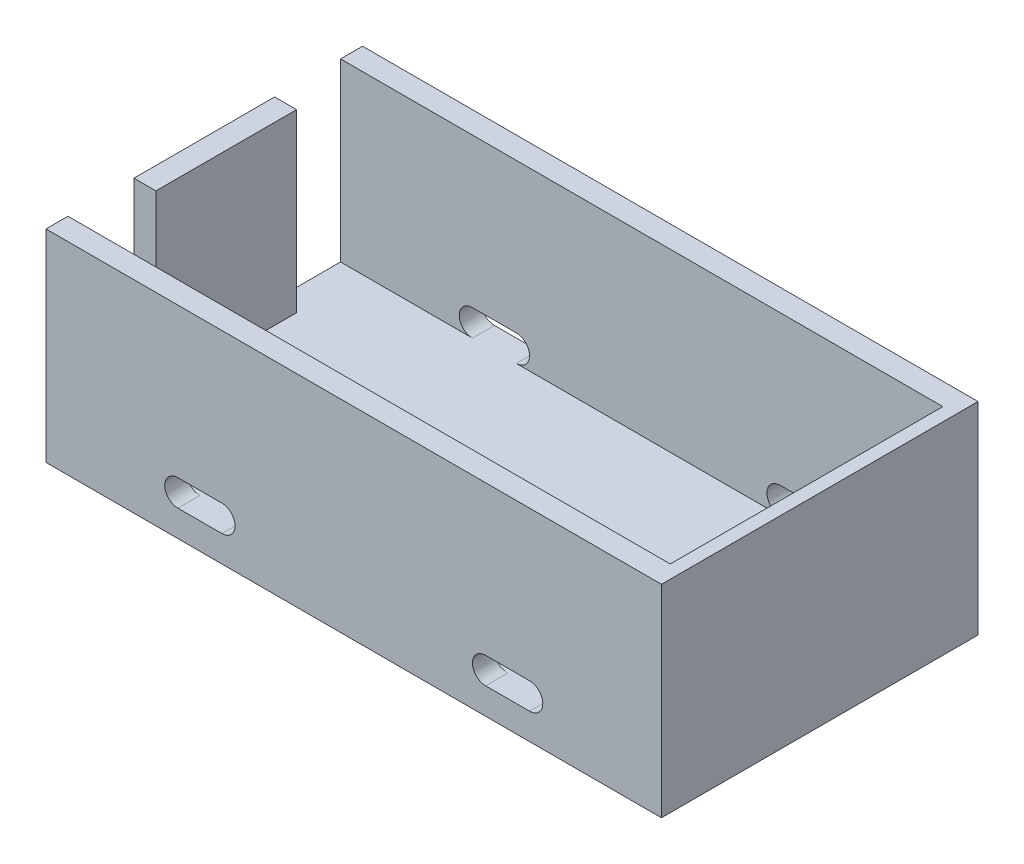
ISO-10303-21;
HEADER;
FILE_DESCRIPTION(('STEP AP214'),'2;1');
FILE_NAME('part.step','',(''),(''),'','','');
FILE_SCHEMA(('AUTOMOTIVE_DESIGN { 1 0 10303 214 1 1 1 1 }'));
ENDSEC;
DATA;
#1=APPLICATION_CONTEXT('core data for automotive mechanical design processes');
#2=APPLICATION_PROTOCOL_DEFINITION('international standard','automotive_design',2000,#1);
#3=PRODUCT_CONTEXT('',#1,'mechanical');
#4=PRODUCT('Part','Part','',(#3));
#5=PRODUCT_RELATED_PRODUCT_CATEGORY('part','',(#4));
#6=PRODUCT_DEFINITION_FORMATION('','',#4);
#7=PRODUCT_DEFINITION_CONTEXT('part definition',#1,'design');
#8=PRODUCT_DEFINITION('design','',#6,#7);
#9=PRODUCT_DEFINITION_SHAPE('','',#8);
#10=(LENGTH_UNIT() NAMED_UNIT(*) SI_UNIT(.MILLI.,.METRE.));
#11=(NAMED_UNIT(*) PLANE_ANGLE_UNIT() SI_UNIT($,.RADIAN.));
#12=(NAMED_UNIT(*) SI_UNIT($,.STERADIAN.) SOLID_ANGLE_UNIT());
#13=UNCERTAINTY_MEASURE_WITH_UNIT(LENGTH_MEASURE(1.E-05),#10,'distance_accuracy_value','');
#14=(GEOMETRIC_REPRESENTATION_CONTEXT(3) GLOBAL_UNCERTAINTY_ASSIGNED_CONTEXT((#13)) GLOBAL_UNIT_ASSIGNED_CONTEXT((#10,
#11,#12)) REPRESENTATION_CONTEXT('',''));
#15=CARTESIAN_POINT('',(0.,0.,0.));
#16=DIRECTION('',(0.,0.,1.));
#17=DIRECTION('',(1.,0.,0.));
#18=AXIS2_PLACEMENT_3D('',#15,#16,#17);
#19=CARTESIAN_POINT('',(70.,-3.,0.));
#20=DIRECTION('',(0.,0.,-1.));
#21=DIRECTION('',(-1.,0.,0.));
#22=AXIS2_PLACEMENT_3D('',#19,#20,#21);
#23=PLANE('',#22);
#24=DIRECTION('',(1.,0.,0.));
#25=VECTOR('',#24,1.);
#26=CARTESIAN_POINT('',(15.,0.,0.));
#27=LINE('',#26,#25);
#28=CARTESIAN_POINT('',(15.,0.,0.));
#29=VERTEX_POINT('',#28);
#30=CARTESIAN_POINT('',(20.,0.,0.));
#31=VERTEX_POINT('',#30);
#32=EDGE_CURVE('E255',#29,#31,#27,.T.);
#33=ORIENTED_EDGE('',*,*,#32,.F.);
#34=CARTESIAN_POINT('',(15.,1.5,0.));
#35=DIRECTION('',(0.,0.,1.));
#36=DIRECTION('',(1.,0.,0.));
#37=AXIS2_PLACEMENT_3D('',#34,#35,#36);
#38=CIRCLE('',#37,1.5);
#39=CARTESIAN_POINT('',(15.,3.,0.));
#40=VERTEX_POINT('',#39);
#41=EDGE_CURVE('E48',#40,#29,#38,.T.);
#42=ORIENTED_EDGE('',*,*,#41,.F.);
#43=DIRECTION('',(-1.,0.,0.));
#44=VECTOR('',#43,1.);
#45=CARTESIAN_POINT('',(70.,3.,0.));
#46=LINE('',#45,#44);
#47=CARTESIAN_POINT('',(20.,3.,0.));
#48=VERTEX_POINT('',#47);
#49=EDGE_CURVE('E101',#40,#48,#46,.F.);
#50=ORIENTED_EDGE('',*,*,#49,.T.);
#51=CARTESIAN_POINT('',(20.,1.5,0.));
#52=DIRECTION('',(0.,0.,1.));
#53=DIRECTION('',(1.,0.,0.));
#54=AXIS2_PLACEMENT_3D('',#51,#52,#53);
#55=CIRCLE('',#54,1.5);
#56=EDGE_CURVE('E237',#31,#48,#55,.T.);
#57=ORIENTED_EDGE('',*,*,#56,.F.);
#58=EDGE_LOOP('',(#33,#42,#50,#57));
#59=FACE_BOUND('',#58,.T.);
#60=DIRECTION('',(0.,1.,0.));
#61=VECTOR('',#60,1.);
#62=CARTESIAN_POINT('',(70.,-3.,0.));
#63=LINE('',#62,#61);
#64=CARTESIAN_POINT('',(70.,-3.,0.));
#65=VERTEX_POINT('',#64);
#66=CARTESIAN_POINT('',(70.,20.,0.));
#67=VERTEX_POINT('',#66);
#68=EDGE_CURVE('E353',#65,#67,#63,.T.);
#69=ORIENTED_EDGE('',*,*,#68,.T.);
#70=DIRECTION('',(1.,0.,0.));
#71=VECTOR('',#70,1.);
#72=CARTESIAN_POINT('',(0.,20.,0.));
#73=LINE('',#72,#71);
#74=CARTESIAN_POINT('',(0.,20.,0.));
#75=VERTEX_POINT('',#74);
#76=EDGE_CURVE('E320',#75,#67,#73,.T.);
#77=ORIENTED_EDGE('',*,*,#76,.F.);
#78=DIRECTION('',(0.,1.,0.));
#79=VECTOR('',#78,1.);
#80=CARTESIAN_POINT('',(0.,-3.,0.));
#81=LINE('',#80,#79);
#82=CARTESIAN_POINT('',(0.,-3.,0.));
#83=VERTEX_POINT('',#82);
#84=EDGE_CURVE('E350',#83,#75,#81,.T.);
#85=ORIENTED_EDGE('',*,*,#84,.F.);
#86=DIRECTION('',(-1.,0.,0.));
#87=VECTOR('',#86,1.);
#88=CARTESIAN_POINT('',(70.,-3.,0.));
#89=LINE('',#88,#87);
#90=EDGE_CURVE('E332',#65,#83,#89,.T.);
#91=ORIENTED_EDGE('',*,*,#90,.F.);
#92=EDGE_LOOP('',(#69,#77,#85,#91));
#93=FACE_BOUND('',#92,.T.);
#94=CARTESIAN_POINT('',(55.,1.5,0.));
#95=DIRECTION('',(0.,0.,1.));
#96=DIRECTION('',(1.,0.,0.));
#97=AXIS2_PLACEMENT_3D('',#94,#95,#96);
#98=CIRCLE('',#97,1.5);
#99=CARTESIAN_POINT('',(55.,3.,0.));
#100=VERTEX_POINT('',#99);
#101=CARTESIAN_POINT('',(55.,0.,0.));
#102=VERTEX_POINT('',#101);
#103=EDGE_CURVE('E260',#100,#102,#98,.F.);
#104=ORIENTED_EDGE('',*,*,#103,.T.);
#105=DIRECTION('',(-1.,0.,0.));
#106=VECTOR('',#105,1.);
#107=CARTESIAN_POINT('',(70.,0.,0.));
#108=LINE('',#107,#106);
#109=CARTESIAN_POINT('',(50.,0.,0.));
#110=VERTEX_POINT('',#109);
#111=EDGE_CURVE('E418',#102,#110,#108,.T.);
#112=ORIENTED_EDGE('',*,*,#111,.T.);
#113=CARTESIAN_POINT('',(50.,1.5,0.));
#114=DIRECTION('',(0.,0.,1.));
#115=DIRECTION('',(1.,0.,0.));
#116=AXIS2_PLACEMENT_3D('',#113,#114,#115);
#117=CIRCLE('',#116,1.5);
#118=CARTESIAN_POINT('',(50.,3.,0.));
#119=VERTEX_POINT('',#118);
#120=EDGE_CURVE('E414',#110,#119,#117,.F.);
#121=ORIENTED_EDGE('',*,*,#120,.T.);
#122=DIRECTION('',(-1.,0.,0.));
#123=VECTOR('',#122,1.);
#124=CARTESIAN_POINT('',(55.,3.,0.));
#125=LINE('',#124,#123);
#126=EDGE_CURVE('E200',#100,#119,#125,.T.);
#127=ORIENTED_EDGE('',*,*,#126,.F.);
#128=EDGE_LOOP('',(#104,#112,#121,#127));
#129=FACE_BOUND('',#128,.T.);
#130=ADVANCED_FACE('F44',(#59,#93,#129),#23,.F.);
#131=CARTESIAN_POINT('',(70.,-3.,-36.));
#132=DIRECTION('',(0.,0.,1.));
#133=DIRECTION('',(1.,0.,0.));
#134=AXIS2_PLACEMENT_3D('',#131,#132,#133);
#135=PLANE('',#134);
#136=DIRECTION('',(1.,0.,0.));
#137=VECTOR('',#136,1.);
#138=CARTESIAN_POINT('',(15.,3.,-36.));
#139=LINE('',#138,#137);
#140=CARTESIAN_POINT('',(15.,3.,-36.));
#141=VERTEX_POINT('',#140);
#142=CARTESIAN_POINT('',(20.,3.,-36.));
#143=VERTEX_POINT('',#142);
#144=EDGE_CURVE('E560',#141,#143,#139,.T.);
#145=ORIENTED_EDGE('',*,*,#144,.F.);
#146=CARTESIAN_POINT('',(15.,1.5,-36.));
#147=DIRECTION('',(0.,0.,1.));
#148=DIRECTION('',(1.,0.,0.));
#149=AXIS2_PLACEMENT_3D('',#146,#147,#148);
#150=CIRCLE('',#149,1.5);
#151=CARTESIAN_POINT('',(15.,0.,-36.));
#152=VERTEX_POINT('',#151);
#153=EDGE_CURVE('E552',#141,#152,#150,.T.);
#154=ORIENTED_EDGE('',*,*,#153,.T.);
#155=DIRECTION('',(1.,0.,0.));
#156=VECTOR('',#155,1.);
#157=CARTESIAN_POINT('',(15.,0.,-36.));
#158=LINE('',#157,#156);
#159=CARTESIAN_POINT('',(20.,0.,-36.));
#160=VERTEX_POINT('',#159);
#161=EDGE_CURVE('E611',#152,#160,#158,.T.);
#162=ORIENTED_EDGE('',*,*,#161,.T.);
#163=CARTESIAN_POINT('',(20.,1.5,-36.));
#164=DIRECTION('',(0.,0.,1.));
#165=DIRECTION('',(1.,0.,0.));
#166=AXIS2_PLACEMENT_3D('',#163,#164,#165);
#167=CIRCLE('',#166,1.5);
#168=EDGE_CURVE('E608',#160,#143,#167,.T.);
#169=ORIENTED_EDGE('',*,*,#168,.T.);
#170=EDGE_LOOP('',(#145,#154,#162,#169));
#171=FACE_BOUND('',#170,.T.);
#172=DIRECTION('',(0.,1.,0.));
#173=VECTOR('',#172,1.);
#174=CARTESIAN_POINT('',(0.,-3.,-36.));
#175=LINE('',#174,#173);
#176=CARTESIAN_POINT('',(0.,-3.,-36.));
#177=VERTEX_POINT('',#176);
#178=CARTESIAN_POINT('',(0.,20.,-36.));
#179=VERTEX_POINT('',#178);
#180=EDGE_CURVE('E347',#177,#179,#175,.T.);
#181=ORIENTED_EDGE('',*,*,#180,.T.);
#182=DIRECTION('',(1.,0.,0.));
#183=VECTOR('',#182,1.);
#184=CARTESIAN_POINT('',(0.,20.,-36.));
#185=LINE('',#184,#183);
#186=CARTESIAN_POINT('',(70.,20.,-36.));
#187=VERTEX_POINT('',#186);
#188=EDGE_CURVE('E282',#179,#187,#185,.T.);
#189=ORIENTED_EDGE('',*,*,#188,.T.);
#190=DIRECTION('',(0.,1.,0.));
#191=VECTOR('',#190,1.);
#192=CARTESIAN_POINT('',(70.,-3.,-36.));
#193=LINE('',#192,#191);
#194=CARTESIAN_POINT('',(70.,-3.,-36.));
#195=VERTEX_POINT('',#194);
#196=EDGE_CURVE('E342',#195,#187,#193,.T.);
#197=ORIENTED_EDGE('',*,*,#196,.F.);
#198=DIRECTION('',(1.,0.,0.));
#199=VECTOR('',#198,1.);
#200=CARTESIAN_POINT('',(70.,-3.,-36.));
#201=LINE('',#200,#199);
#202=EDGE_CURVE('E339',#177,#195,#201,.T.);
#203=ORIENTED_EDGE('',*,*,#202,.F.);
#204=EDGE_LOOP('',(#181,#189,#197,#203));
#205=FACE_BOUND('',#204,.T.);
#206=CARTESIAN_POINT('',(55.,1.5,-36.));
#207=DIRECTION('',(0.,0.,-1.));
#208=DIRECTION('',(-1.,0.,0.));
#209=AXIS2_PLACEMENT_3D('',#206,#207,#208);
#210=CIRCLE('',#209,1.5);
#211=CARTESIAN_POINT('',(55.,3.,-36.));
#212=VERTEX_POINT('',#211);
#213=CARTESIAN_POINT('',(55.,0.,-36.));
#214=VERTEX_POINT('',#213);
#215=EDGE_CURVE('E597',#212,#214,#210,.T.);
#216=ORIENTED_EDGE('',*,*,#215,.F.);
#217=DIRECTION('',(-1.,0.,0.));
#218=VECTOR('',#217,1.);
#219=CARTESIAN_POINT('',(55.,3.,-36.));
#220=LINE('',#219,#218);
#221=CARTESIAN_POINT('',(50.,3.,-36.));
#222=VERTEX_POINT('',#221);
#223=EDGE_CURVE('E572',#212,#222,#220,.T.);
#224=ORIENTED_EDGE('',*,*,#223,.T.);
#225=CARTESIAN_POINT('',(50.,1.5,-36.));
#226=DIRECTION('',(0.,0.,-1.));
#227=DIRECTION('',(-1.,0.,0.));
#228=AXIS2_PLACEMENT_3D('',#225,#226,#227);
#229=CIRCLE('',#228,1.5);
#230=CARTESIAN_POINT('',(50.,0.,-36.));
#231=VERTEX_POINT('',#230);
#232=EDGE_CURVE('E589',#231,#222,#229,.T.);
#233=ORIENTED_EDGE('',*,*,#232,.F.);
#234=DIRECTION('',(-1.,0.,0.));
#235=VECTOR('',#234,1.);
#236=CARTESIAN_POINT('',(55.,0.,-36.));
#237=LINE('',#236,#235);
#238=EDGE_CURVE('E593',#214,#231,#237,.T.);
#239=ORIENTED_EDGE('',*,*,#238,.F.);
#240=EDGE_LOOP('',(#216,#224,#233,#239));
#241=FACE_BOUND('',#240,.T.);
#242=ADVANCED_FACE('F477',(#171,#205,#241),#135,.F.);
#243=CARTESIAN_POINT('',(0.,20.,-2.5));
#244=DIRECTION('',(0.,0.,-1.));
#245=DIRECTION('',(-1.,0.,0.));
#246=AXIS2_PLACEMENT_3D('',#243,#244,#245);
#247=PLANE('',#246);
#248=CARTESIAN_POINT('',(15.,1.5,-2.5));
#249=DIRECTION('',(0.,0.,-1.));
#250=DIRECTION('',(-1.,0.,0.));
#251=AXIS2_PLACEMENT_3D('',#248,#249,#250);
#252=CIRCLE('',#251,1.5);
#253=CARTESIAN_POINT('',(15.,0.,-2.5));
#254=VERTEX_POINT('',#253);
#255=CARTESIAN_POINT('',(15.,3.,-2.5));
#256=VERTEX_POINT('',#255);
#257=EDGE_CURVE('E110',#254,#256,#252,.T.);
#258=ORIENTED_EDGE('',*,*,#257,.F.);
#259=DIRECTION('',(1.,0.,0.));
#260=VECTOR('',#259,1.);
#261=CARTESIAN_POINT('',(0.,0.,-2.5));
#262=LINE('',#261,#260);
#263=CARTESIAN_POINT('',(0.,0.,-2.5));
#264=VERTEX_POINT('',#263);
#265=EDGE_CURVE('E299',#264,#254,#262,.T.);
#266=ORIENTED_EDGE('',*,*,#265,.F.);
#267=DIRECTION('',(0.,-1.,0.));
#268=VECTOR('',#267,1.);
#269=CARTESIAN_POINT('',(0.,20.,-2.5));
#270=LINE('',#269,#268);
#271=CARTESIAN_POINT('',(0.,20.,-2.5));
#272=VERTEX_POINT('',#271);
#273=EDGE_CURVE('E304',#272,#264,#270,.T.);
#274=ORIENTED_EDGE('',*,*,#273,.F.);
#275=DIRECTION('',(1.,0.,0.));
#276=VECTOR('',#275,1.);
#277=CARTESIAN_POINT('',(0.,20.,-2.5));
#278=LINE('',#277,#276);
#279=CARTESIAN_POINT('',(68.5,20.,-2.5));
#280=VERTEX_POINT('',#279);
#281=EDGE_CURVE('E324',#272,#280,#278,.T.);
#282=ORIENTED_EDGE('',*,*,#281,.T.);
#283=DIRECTION('',(0.,-1.,0.));
#284=VECTOR('',#283,1.);
#285=CARTESIAN_POINT('',(68.5,20.,-2.50000000000002));
#286=LINE('',#285,#284);
#287=CARTESIAN_POINT('',(68.5,0.,-2.5));
#288=VERTEX_POINT('',#287);
#289=EDGE_CURVE('E300',#280,#288,#286,.T.);
#290=ORIENTED_EDGE('',*,*,#289,.T.);
#291=CARTESIAN_POINT('',(55.,0.,-2.5));
#292=VERTEX_POINT('',#291);
#293=EDGE_CURVE('E316',#292,#288,#262,.T.);
#294=ORIENTED_EDGE('',*,*,#293,.F.);
#295=CARTESIAN_POINT('',(55.,1.5,-2.5));
#296=DIRECTION('',(0.,0.,-1.));
#297=DIRECTION('',(-1.,0.,0.));
#298=AXIS2_PLACEMENT_3D('',#295,#296,#297);
#299=CIRCLE('',#298,1.5);
#300=CARTESIAN_POINT('',(55.,3.,-2.5));
#301=VERTEX_POINT('',#300);
#302=EDGE_CURVE('E263',#292,#301,#299,.F.);
#303=ORIENTED_EDGE('',*,*,#302,.T.);
#304=DIRECTION('',(1.,0.,0.));
#305=VECTOR('',#304,1.);
#306=CARTESIAN_POINT('',(0.,3.,-2.5));
#307=LINE('',#306,#305);
#308=CARTESIAN_POINT('',(50.,3.,-2.5));
#309=VERTEX_POINT('',#308);
#310=EDGE_CURVE('E413',#309,#301,#307,.T.);
#311=ORIENTED_EDGE('',*,*,#310,.F.);
#312=CARTESIAN_POINT('',(50.,1.5,-2.5));
#313=DIRECTION('',(0.,0.,-1.));
#314=DIRECTION('',(-1.,0.,0.));
#315=AXIS2_PLACEMENT_3D('',#312,#313,#314);
#316=CIRCLE('',#315,1.5);
#317=CARTESIAN_POINT('',(50.,0.,-2.5));
#318=VERTEX_POINT('',#317);
#319=EDGE_CURVE('E412',#309,#318,#316,.F.);
#320=ORIENTED_EDGE('',*,*,#319,.T.);
#321=CARTESIAN_POINT('',(20.,0.,-2.5));
#322=VERTEX_POINT('',#321);
#323=EDGE_CURVE('E253',#322,#318,#262,.T.);
#324=ORIENTED_EDGE('',*,*,#323,.F.);
#325=CARTESIAN_POINT('',(20.,1.5,-2.5));
#326=DIRECTION('',(0.,0.,-1.));
#327=DIRECTION('',(-1.,0.,0.));
#328=AXIS2_PLACEMENT_3D('',#325,#326,#327);
#329=CIRCLE('',#328,1.5);
#330=CARTESIAN_POINT('',(20.,3.,-2.5));
#331=VERTEX_POINT('',#330);
#332=EDGE_CURVE('E243',#331,#322,#329,.T.);
#333=ORIENTED_EDGE('',*,*,#332,.F.);
#334=DIRECTION('',(-1.,0.,0.));
#335=VECTOR('',#334,1.);
#336=CARTESIAN_POINT('',(0.,3.,-2.5));
#337=LINE('',#336,#335);
#338=EDGE_CURVE('E229',#331,#256,#337,.T.);
#339=ORIENTED_EDGE('',*,*,#338,.T.);
#340=EDGE_LOOP('',(#258,#266,#274,#282,#290,#294,#303,#311,#320,#324,#333,#339));
#341=FACE_BOUND('',#340,.T.);
#342=ADVANCED_FACE('F250',(#341),#247,.T.);
#343=CARTESIAN_POINT('',(0.,20.,-33.5));
#344=DIRECTION('',(0.,0.,-1.));
#345=DIRECTION('',(-1.,0.,0.));
#346=AXIS2_PLACEMENT_3D('',#343,#344,#345);
#347=PLANE('',#346);
#348=DIRECTION('',(1.,0.,0.));
#349=VECTOR('',#348,1.);
#350=CARTESIAN_POINT('',(0.,0.,-33.5));
#351=LINE('',#350,#349);
#352=CARTESIAN_POINT('',(0.,0.,-33.5));
#353=VERTEX_POINT('',#352);
#354=CARTESIAN_POINT('',(15.,0.,-33.5));
#355=VERTEX_POINT('',#354);
#356=EDGE_CURVE('E273',#353,#355,#351,.T.);
#357=ORIENTED_EDGE('',*,*,#356,.T.);
#358=CARTESIAN_POINT('',(15.,1.5,-33.5));
#359=DIRECTION('',(0.,0.,-1.));
#360=DIRECTION('',(-1.,0.,0.));
#361=AXIS2_PLACEMENT_3D('',#358,#359,#360);
#362=CIRCLE('',#361,1.5);
#363=CARTESIAN_POINT('',(15.,3.,-33.5));
#364=VERTEX_POINT('',#363);
#365=EDGE_CURVE('E11',#355,#364,#362,.T.);
#366=ORIENTED_EDGE('',*,*,#365,.T.);
#367=DIRECTION('',(-1.,0.,0.));
#368=VECTOR('',#367,1.);
#369=CARTESIAN_POINT('',(0.,3.,-33.5));
#370=LINE('',#369,#368);
#371=CARTESIAN_POINT('',(20.,3.,-33.5));
#372=VERTEX_POINT('',#371);
#373=EDGE_CURVE('E54',#372,#364,#370,.T.);
#374=ORIENTED_EDGE('',*,*,#373,.F.);
#375=CARTESIAN_POINT('',(20.,1.5,-33.5));
#376=DIRECTION('',(0.,0.,-1.));
#377=DIRECTION('',(-1.,0.,0.));
#378=AXIS2_PLACEMENT_3D('',#375,#376,#377);
#379=CIRCLE('',#378,1.5);
#380=CARTESIAN_POINT('',(20.,0.,-33.5));
#381=VERTEX_POINT('',#380);
#382=EDGE_CURVE('E404',#372,#381,#379,.T.);
#383=ORIENTED_EDGE('',*,*,#382,.T.);
#384=CARTESIAN_POINT('',(50.,0.,-33.5));
#385=VERTEX_POINT('',#384);
#386=EDGE_CURVE('E278',#381,#385,#351,.T.);
#387=ORIENTED_EDGE('',*,*,#386,.T.);
#388=CARTESIAN_POINT('',(50.,1.5,-33.5));
#389=DIRECTION('',(0.,0.,-1.));
#390=DIRECTION('',(-1.,0.,0.));
#391=AXIS2_PLACEMENT_3D('',#388,#389,#390);
#392=CIRCLE('',#391,1.5);
#393=CARTESIAN_POINT('',(50.,3.,-33.5));
#394=VERTEX_POINT('',#393);
#395=EDGE_CURVE('E397',#394,#385,#392,.F.);
#396=ORIENTED_EDGE('',*,*,#395,.F.);
#397=DIRECTION('',(1.,0.,0.));
#398=VECTOR('',#397,1.);
#399=CARTESIAN_POINT('',(0.,3.,-33.5));
#400=LINE('',#399,#398);
#401=CARTESIAN_POINT('',(55.,3.,-33.5));
#402=VERTEX_POINT('',#401);
#403=EDGE_CURVE('E210',#394,#402,#400,.T.);
#404=ORIENTED_EDGE('',*,*,#403,.T.);
#405=CARTESIAN_POINT('',(55.,1.5,-33.5));
#406=DIRECTION('',(0.,0.,-1.));
#407=DIRECTION('',(-1.,0.,0.));
#408=AXIS2_PLACEMENT_3D('',#405,#406,#407);
#409=CIRCLE('',#408,1.5);
#410=CARTESIAN_POINT('',(55.,0.,-33.5));
#411=VERTEX_POINT('',#410);
#412=EDGE_CURVE('E400',#411,#402,#409,.F.);
#413=ORIENTED_EDGE('',*,*,#412,.F.);
#414=CARTESIAN_POINT('',(68.5,0.,-33.5));
#415=VERTEX_POINT('',#414);
#416=EDGE_CURVE('E279',#411,#415,#351,.T.);
#417=ORIENTED_EDGE('',*,*,#416,.T.);
#418=DIRECTION('',(0.,-1.,0.));
#419=VECTOR('',#418,1.);
#420=CARTESIAN_POINT('',(68.5,20.,-33.5));
#421=LINE('',#420,#419);
#422=CARTESIAN_POINT('',(68.5,20.,-33.5));
#423=VERTEX_POINT('',#422);
#424=EDGE_CURVE('E294',#423,#415,#421,.T.);
#425=ORIENTED_EDGE('',*,*,#424,.F.);
#426=DIRECTION('',(1.,0.,0.));
#427=VECTOR('',#426,1.);
#428=CARTESIAN_POINT('',(0.,20.,-33.5));
#429=LINE('',#428,#427);
#430=CARTESIAN_POINT('',(0.,20.,-33.5));
#431=VERTEX_POINT('',#430);
#432=EDGE_CURVE('E290',#431,#423,#429,.T.);
#433=ORIENTED_EDGE('',*,*,#432,.F.);
#434=DIRECTION('',(0.,-1.,0.));
#435=VECTOR('',#434,1.);
#436=CARTESIAN_POINT('',(0.,20.,-33.5));
#437=LINE('',#436,#435);
#438=EDGE_CURVE('E268',#431,#353,#437,.T.);
#439=ORIENTED_EDGE('',*,*,#438,.T.);
#440=EDGE_LOOP('',(#357,#366,#374,#383,#387,#396,#404,#413,#417,#425,#433,#439));
#441=FACE_BOUND('',#440,.T.);
#442=ADVANCED_FACE('F453',(#441),#347,.F.);
#443=CARTESIAN_POINT('',(0.,20.,-10.));
#444=DIRECTION('',(0.,0.,-1.));
#445=DIRECTION('',(-1.,0.,0.));
#446=AXIS2_PLACEMENT_3D('',#443,#444,#445);
#447=PLANE('',#446);
#448=DIRECTION('',(1.,0.,0.));
#449=VECTOR('',#448,1.);
#450=CARTESIAN_POINT('',(0.,0.,-10.));
#451=LINE('',#450,#449);
#452=CARTESIAN_POINT('',(0.,0.,-10.));
#453=VERTEX_POINT('',#452);
#454=CARTESIAN_POINT('',(2.5,0.,-10.));
#455=VERTEX_POINT('',#454);
#456=EDGE_CURVE('E356',#453,#455,#451,.T.);
#457=ORIENTED_EDGE('',*,*,#456,.T.);
#458=DIRECTION('',(0.,-1.,0.));
#459=VECTOR('',#458,1.);
#460=CARTESIAN_POINT('',(2.5,20.,-10.));
#461=LINE('',#460,#459);
#462=CARTESIAN_POINT('',(2.5,20.,-10.));
#463=VERTEX_POINT('',#462);
#464=EDGE_CURVE('E391',#463,#455,#461,.T.);
#465=ORIENTED_EDGE('',*,*,#464,.F.);
#466=DIRECTION('',(1.,0.,0.));
#467=VECTOR('',#466,1.);
#468=CARTESIAN_POINT('',(0.,20.,-10.));
#469=LINE('',#468,#467);
#470=CARTESIAN_POINT('',(0.,20.,-10.));
#471=VERTEX_POINT('',#470);
#472=EDGE_CURVE('E357',#471,#463,#469,.T.);
#473=ORIENTED_EDGE('',*,*,#472,.F.);
#474=DIRECTION('',(0.,-1.,0.));
#475=VECTOR('',#474,1.);
#476=CARTESIAN_POINT('',(0.,20.,-10.));
#477=LINE('',#476,#475);
#478=EDGE_CURVE('E372',#471,#453,#477,.T.);
#479=ORIENTED_EDGE('',*,*,#478,.T.);
#480=EDGE_LOOP('',(#457,#465,#473,#479));
#481=FACE_BOUND('',#480,.T.);
#482=ADVANCED_FACE('F46',(#481),#447,.F.);
#483=CARTESIAN_POINT('',(2.5,20.,-26.));
#484=DIRECTION('',(1.,0.,0.));
#485=DIRECTION('',(0.,0.,-1.));
#486=AXIS2_PLACEMENT_3D('',#483,#484,#485);
#487=PLANE('',#486);
#488=DIRECTION('',(0.,0.,1.));
#489=VECTOR('',#488,1.);
#490=CARTESIAN_POINT('',(2.5,0.,-26.));
#491=LINE('',#490,#489);
#492=CARTESIAN_POINT('',(2.5,0.,-26.));
#493=VERTEX_POINT('',#492);
#494=EDGE_CURVE('E375',#493,#455,#491,.T.);
#495=ORIENTED_EDGE('',*,*,#494,.F.);
#496=DIRECTION('',(0.,-1.,0.));
#497=VECTOR('',#496,1.);
#498=CARTESIAN_POINT('',(2.5,20.,-26.));
#499=LINE('',#498,#497);
#500=CARTESIAN_POINT('',(2.5,20.,-26.));
#501=VERTEX_POINT('',#500);
#502=EDGE_CURVE('E388',#501,#493,#499,.T.);
#503=ORIENTED_EDGE('',*,*,#502,.F.);
#504=DIRECTION('',(0.,0.,1.));
#505=VECTOR('',#504,1.);
#506=CARTESIAN_POINT('',(2.5,20.,-26.));
#507=LINE('',#506,#505);
#508=EDGE_CURVE('E360',#501,#463,#507,.T.);
#509=ORIENTED_EDGE('',*,*,#508,.T.);
#510=ORIENTED_EDGE('',*,*,#464,.T.);
#511=EDGE_LOOP('',(#495,#503,#509,#510));
#512=FACE_BOUND('',#511,.T.);
#513=ADVANCED_FACE('F791',(#512),#487,.T.);
#514=CARTESIAN_POINT('',(0.,20.,-26.));
#515=DIRECTION('',(0.,0.,-1.));
#516=DIRECTION('',(-1.,0.,0.));
#517=AXIS2_PLACEMENT_3D('',#514,#515,#516);
#518=PLANE('',#517);
#519=DIRECTION('',(1.,0.,0.));
#520=VECTOR('',#519,1.);
#521=CARTESIAN_POINT('',(0.,0.,-26.));
#522=LINE('',#521,#520);
#523=CARTESIAN_POINT('',(0.,0.,-26.));
#524=VERTEX_POINT('',#523);
#525=EDGE_CURVE('E361',#524,#493,#522,.T.);
#526=ORIENTED_EDGE('',*,*,#525,.F.);
#527=DIRECTION('',(0.,-1.,0.));
#528=VECTOR('',#527,1.);
#529=CARTESIAN_POINT('',(0.,20.,-26.));
#530=LINE('',#529,#528);
#531=CARTESIAN_POINT('',(0.,20.,-26.));
#532=VERTEX_POINT('',#531);
#533=EDGE_CURVE('E385',#532,#524,#530,.T.);
#534=ORIENTED_EDGE('',*,*,#533,.F.);
#535=DIRECTION('',(1.,0.,0.));
#536=VECTOR('',#535,1.);
#537=CARTESIAN_POINT('',(0.,20.,-26.));
#538=LINE('',#537,#536);
#539=EDGE_CURVE('E365',#532,#501,#538,.T.);
#540=ORIENTED_EDGE('',*,*,#539,.T.);
#541=ORIENTED_EDGE('',*,*,#502,.T.);
#542=EDGE_LOOP('',(#526,#534,#540,#541));
#543=FACE_BOUND('',#542,.T.);
#544=ADVANCED_FACE('F782',(#543),#518,.T.);
#545=CARTESIAN_POINT('',(0.,20.,-26.));
#546=DIRECTION('',(1.,0.,0.));
#547=DIRECTION('',(0.,0.,-1.));
#548=AXIS2_PLACEMENT_3D('',#545,#546,#547);
#549=PLANE('',#548);
#550=ORIENTED_EDGE('',*,*,#533,.T.);
#551=DIRECTION('',(0.,0.,-1.));
#552=VECTOR('',#551,1.);
#553=CARTESIAN_POINT('',(0.,0.,0.));
#554=LINE('',#553,#552);
#555=EDGE_CURVE('E277',#524,#353,#554,.T.);
#556=ORIENTED_EDGE('',*,*,#555,.T.);
#557=ORIENTED_EDGE('',*,*,#438,.F.);
#558=DIRECTION('',(0.,0.,1.));
#559=VECTOR('',#558,1.);
#560=CARTESIAN_POINT('',(0.,20.,-36.));
#561=LINE('',#560,#559);
#562=EDGE_CURVE('E271',#179,#431,#561,.T.);
#563=ORIENTED_EDGE('',*,*,#562,.F.);
#564=ORIENTED_EDGE('',*,*,#180,.F.);
#565=DIRECTION('',(0.,0.,-1.));
#566=VECTOR('',#565,1.);
#567=CARTESIAN_POINT('',(0.,-3.,0.));
#568=LINE('',#567,#566);
#569=EDGE_CURVE('E336',#83,#177,#568,.T.);
#570=ORIENTED_EDGE('',*,*,#569,.F.);
#571=ORIENTED_EDGE('',*,*,#84,.T.);
#572=DIRECTION('',(0.,0.,-1.));
#573=VECTOR('',#572,1.);
#574=CARTESIAN_POINT('',(0.,20.,0.));
#575=LINE('',#574,#573);
#576=EDGE_CURVE('E313',#75,#272,#575,.T.);
#577=ORIENTED_EDGE('',*,*,#576,.T.);
#578=ORIENTED_EDGE('',*,*,#273,.T.);
#579=EDGE_CURVE('E333',#264,#453,#554,.T.);
#580=ORIENTED_EDGE('',*,*,#579,.T.);
#581=ORIENTED_EDGE('',*,*,#478,.F.);
#582=DIRECTION('',(0.,0.,1.));
#583=VECTOR('',#582,1.);
#584=CARTESIAN_POINT('',(0.,20.,-26.));
#585=LINE('',#584,#583);
#586=EDGE_CURVE('E369',#532,#471,#585,.T.);
#587=ORIENTED_EDGE('',*,*,#586,.F.);
#588=EDGE_LOOP('',(#550,#556,#557,#563,#564,#570,#571,#577,#578,#580,#581,#587));
#589=FACE_BOUND('',#588,.T.);
#590=ADVANCED_FACE('F440',(#589),#549,.F.);
#591=CARTESIAN_POINT('',(0.,20.,0.));
#592=DIRECTION('',(0.,-1.,0.));
#593=DIRECTION('',(0.,0.,-1.));
#594=AXIS2_PLACEMENT_3D('',#591,#592,#593);
#595=PLANE('',#594);
#596=ORIENTED_EDGE('',*,*,#472,.T.);
#597=ORIENTED_EDGE('',*,*,#508,.F.);
#598=ORIENTED_EDGE('',*,*,#539,.F.);
#599=ORIENTED_EDGE('',*,*,#586,.T.);
#600=EDGE_LOOP('',(#596,#597,#598,#599));
#601=FACE_BOUND('',#600,.T.);
#602=ADVANCED_FACE('F492',(#601),#595,.F.);
#603=CARTESIAN_POINT('',(0.,0.,0.));
#604=DIRECTION('',(0.,1.,0.));
#605=DIRECTION('',(0.,0.,1.));
#606=AXIS2_PLACEMENT_3D('',#603,#604,#605);
#607=PLANE('',#606);
#608=ORIENTED_EDGE('',*,*,#416,.F.);
#609=DIRECTION('',(0.,0.,1.));
#610=VECTOR('',#609,1.);
#611=CARTESIAN_POINT('',(55.,0.,-36.));
#612=LINE('',#611,#610);
#613=EDGE_CURVE('E582',#214,#411,#612,.T.);
#614=ORIENTED_EDGE('',*,*,#613,.F.);
#615=ORIENTED_EDGE('',*,*,#238,.T.);
#616=DIRECTION('',(0.,0.,1.));
#617=VECTOR('',#616,1.);
#618=CARTESIAN_POINT('',(50.,0.,-36.));
#619=LINE('',#618,#617);
#620=EDGE_CURVE('E577',#231,#385,#619,.T.);
#621=ORIENTED_EDGE('',*,*,#620,.T.);
#622=ORIENTED_EDGE('',*,*,#386,.F.);
#623=DIRECTION('',(0.,0.,1.));
#624=VECTOR('',#623,1.);
#625=CARTESIAN_POINT('',(20.,0.,-36.));
#626=LINE('',#625,#624);
#627=EDGE_CURVE('E248',#160,#381,#626,.T.);
#628=ORIENTED_EDGE('',*,*,#627,.F.);
#629=ORIENTED_EDGE('',*,*,#161,.F.);
#630=DIRECTION('',(0.,0.,1.));
#631=VECTOR('',#630,1.);
#632=CARTESIAN_POINT('',(15.,0.,-36.));
#633=LINE('',#632,#631);
#634=EDGE_CURVE('E450',#152,#355,#633,.T.);
#635=ORIENTED_EDGE('',*,*,#634,.T.);
#636=ORIENTED_EDGE('',*,*,#356,.F.);
#637=ORIENTED_EDGE('',*,*,#555,.F.);
#638=ORIENTED_EDGE('',*,*,#525,.T.);
#639=ORIENTED_EDGE('',*,*,#494,.T.);
#640=ORIENTED_EDGE('',*,*,#456,.F.);
#641=ORIENTED_EDGE('',*,*,#579,.F.);
#642=ORIENTED_EDGE('',*,*,#265,.T.);
#643=EDGE_CURVE('E62',#254,#29,#633,.T.);
#644=ORIENTED_EDGE('',*,*,#643,.T.);
#645=ORIENTED_EDGE('',*,*,#32,.T.);
#646=EDGE_CURVE('E566',#322,#31,#626,.T.);
#647=ORIENTED_EDGE('',*,*,#646,.F.);
#648=ORIENTED_EDGE('',*,*,#323,.T.);
#649=EDGE_CURVE('E581',#318,#110,#619,.T.);
#650=ORIENTED_EDGE('',*,*,#649,.T.);
#651=ORIENTED_EDGE('',*,*,#111,.F.);
#652=EDGE_CURVE('E585',#292,#102,#612,.T.);
#653=ORIENTED_EDGE('',*,*,#652,.F.);
#654=ORIENTED_EDGE('',*,*,#293,.T.);
#655=DIRECTION('',(0.,0.,1.));
#656=VECTOR('',#655,1.);
#657=CARTESIAN_POINT('',(68.5,0.,-33.5));
#658=LINE('',#657,#656);
#659=EDGE_CURVE('E272',#415,#288,#658,.T.);
#660=ORIENTED_EDGE('',*,*,#659,.F.);
#661=EDGE_LOOP('',(#608,#614,#615,#621,#622,#628,#629,#635,#636,#637,#638,#639,#640,#641,#642,
#644,#645,#647,#648,#650,#651,#653,#654,#660));
#662=FACE_BOUND('',#661,.T.);
#663=ADVANCED_FACE('F447',(#662),#607,.T.);
#664=CARTESIAN_POINT('',(70.,-3.,0.));
#665=DIRECTION('',(-1.,0.,0.));
#666=DIRECTION('',(0.,0.,1.));
#667=AXIS2_PLACEMENT_3D('',#664,#665,#666);
#668=PLANE('',#667);
#669=ORIENTED_EDGE('',*,*,#196,.T.);
#670=DIRECTION('',(0.,0.,1.));
#671=VECTOR('',#670,1.);
#672=CARTESIAN_POINT('',(70.,20.,-36.));
#673=LINE('',#672,#671);
#674=EDGE_CURVE('E286',#187,#67,#673,.T.);
#675=ORIENTED_EDGE('',*,*,#674,.T.);
#676=ORIENTED_EDGE('',*,*,#68,.F.);
#677=DIRECTION('',(0.,0.,1.));
#678=VECTOR('',#677,1.);
#679=CARTESIAN_POINT('',(70.,-3.,0.));
#680=LINE('',#679,#678);
#681=EDGE_CURVE('E328',#195,#65,#680,.T.);
#682=ORIENTED_EDGE('',*,*,#681,.F.);
#683=EDGE_LOOP('',(#669,#675,#676,#682));
#684=FACE_BOUND('',#683,.T.);
#685=ADVANCED_FACE('F483',(#684),#668,.F.);
#686=CARTESIAN_POINT('',(0.,-3.,0.));
#687=DIRECTION('',(0.,1.,0.));
#688=DIRECTION('',(0.,0.,1.));
#689=AXIS2_PLACEMENT_3D('',#686,#687,#688);
#690=PLANE('',#689);
#691=ORIENTED_EDGE('',*,*,#681,.T.);
#692=ORIENTED_EDGE('',*,*,#90,.T.);
#693=ORIENTED_EDGE('',*,*,#569,.T.);
#694=ORIENTED_EDGE('',*,*,#202,.T.);
#695=EDGE_LOOP('',(#691,#692,#693,#694));
#696=FACE_BOUND('',#695,.T.);
#697=ADVANCED_FACE('F482',(#696),#690,.F.);
#698=CARTESIAN_POINT('',(0.,20.,0.));
#699=DIRECTION('',(0.,1.,0.));
#700=DIRECTION('',(0.,0.,1.));
#701=AXIS2_PLACEMENT_3D('',#698,#699,#700);
#702=PLANE('',#701);
#703=ORIENTED_EDGE('',*,*,#281,.F.);
#704=ORIENTED_EDGE('',*,*,#576,.F.);
#705=ORIENTED_EDGE('',*,*,#76,.T.);
#706=ORIENTED_EDGE('',*,*,#674,.F.);
#707=ORIENTED_EDGE('',*,*,#188,.F.);
#708=ORIENTED_EDGE('',*,*,#562,.T.);
#709=ORIENTED_EDGE('',*,*,#432,.T.);
#710=DIRECTION('',(0.,0.,1.));
#711=VECTOR('',#710,1.);
#712=CARTESIAN_POINT('',(68.5,20.,-33.5));
#713=LINE('',#712,#711);
#714=EDGE_CURVE('E298',#423,#280,#713,.T.);
#715=ORIENTED_EDGE('',*,*,#714,.T.);
#716=EDGE_LOOP('',(#703,#704,#705,#706,#707,#708,#709,#715));
#717=FACE_BOUND('',#716,.T.);
#718=ADVANCED_FACE('F458',(#717),#702,.T.);
#719=CARTESIAN_POINT('',(68.5,20.,-33.5));
#720=DIRECTION('',(1.,0.,0.));
#721=DIRECTION('',(0.,0.,-1.));
#722=AXIS2_PLACEMENT_3D('',#719,#720,#721);
#723=PLANE('',#722);
#724=ORIENTED_EDGE('',*,*,#659,.T.);
#725=ORIENTED_EDGE('',*,*,#289,.F.);
#726=ORIENTED_EDGE('',*,*,#714,.F.);
#727=ORIENTED_EDGE('',*,*,#424,.T.);
#728=EDGE_LOOP('',(#724,#725,#726,#727));
#729=FACE_BOUND('',#728,.T.);
#730=ADVANCED_FACE('F461',(#729),#723,.F.);
#731=CARTESIAN_POINT('',(55.,3.,-36.));
#732=DIRECTION('',(0.,1.,0.));
#733=DIRECTION('',(-1.,0.,0.));
#734=AXIS2_PLACEMENT_3D('',#731,#732,#733);
#735=PLANE('',#734);
#736=DIRECTION('',(0.,0.,1.));
#737=VECTOR('',#736,1.);
#738=CARTESIAN_POINT('',(50.,3.,-36.));
#739=LINE('',#738,#737);
#740=EDGE_CURVE('E573',#222,#394,#739,.T.);
#741=ORIENTED_EDGE('',*,*,#740,.F.);
#742=ORIENTED_EDGE('',*,*,#223,.F.);
#743=DIRECTION('',(0.,0.,1.));
#744=VECTOR('',#743,1.);
#745=CARTESIAN_POINT('',(55.,3.,-36.));
#746=LINE('',#745,#744);
#747=EDGE_CURVE('E569',#212,#402,#746,.T.);
#748=ORIENTED_EDGE('',*,*,#747,.T.);
#749=ORIENTED_EDGE('',*,*,#403,.F.);
#750=EDGE_LOOP('',(#741,#742,#748,#749));
#751=FACE_BOUND('',#750,.T.);
#752=ADVANCED_FACE('F509',(#751),#735,.F.);
#753=CARTESIAN_POINT('',(50.,1.5,-36.));
#754=DIRECTION('',(0.,0.,1.));
#755=DIRECTION('',(1.,0.,0.));
#756=AXIS2_PLACEMENT_3D('',#753,#754,#755);
#757=CYLINDRICAL_SURFACE('',#756,1.5);
#758=ORIENTED_EDGE('',*,*,#395,.T.);
#759=ORIENTED_EDGE('',*,*,#620,.F.);
#760=ORIENTED_EDGE('',*,*,#232,.T.);
#761=ORIENTED_EDGE('',*,*,#740,.T.);
#762=EDGE_LOOP('',(#758,#759,#760,#761));
#763=FACE_BOUND('',#762,.T.);
#764=ADVANCED_FACE('F521',(#763),#757,.F.);
#765=CARTESIAN_POINT('',(55.,1.5,-36.));
#766=DIRECTION('',(0.,0.,1.));
#767=DIRECTION('',(1.,0.,0.));
#768=AXIS2_PLACEMENT_3D('',#765,#766,#767);
#769=CYLINDRICAL_SURFACE('',#768,1.5);
#770=ORIENTED_EDGE('',*,*,#412,.T.);
#771=ORIENTED_EDGE('',*,*,#747,.F.);
#772=ORIENTED_EDGE('',*,*,#215,.T.);
#773=ORIENTED_EDGE('',*,*,#613,.T.);
#774=EDGE_LOOP('',(#770,#771,#772,#773));
#775=FACE_BOUND('',#774,.T.);
#776=ADVANCED_FACE('F526',(#775),#769,.F.);
#777=CARTESIAN_POINT('',(20.,1.5,-36.));
#778=DIRECTION('',(0.,0.,1.));
#779=DIRECTION('',(1.,0.,0.));
#780=AXIS2_PLACEMENT_3D('',#777,#778,#779);
#781=CYLINDRICAL_SURFACE('',#780,1.5);
#782=DIRECTION('',(0.,0.,1.));
#783=VECTOR('',#782,1.);
#784=CARTESIAN_POINT('',(20.,3.,-36.));
#785=LINE('',#784,#783);
#786=EDGE_CURVE('E247',#143,#372,#785,.T.);
#787=ORIENTED_EDGE('',*,*,#786,.F.);
#788=ORIENTED_EDGE('',*,*,#168,.F.);
#789=ORIENTED_EDGE('',*,*,#627,.T.);
#790=ORIENTED_EDGE('',*,*,#382,.F.);
#791=EDGE_LOOP('',(#787,#788,#789,#790));
#792=FACE_BOUND('',#791,.T.);
#793=ADVANCED_FACE('F531',(#792),#781,.F.);
#794=CARTESIAN_POINT('',(15.,3.,-36.));
#795=DIRECTION('',(0.,-1.,0.));
#796=DIRECTION('',(1.,0.,0.));
#797=AXIS2_PLACEMENT_3D('',#794,#795,#796);
#798=PLANE('',#797);
#799=ORIENTED_EDGE('',*,*,#373,.T.);
#800=DIRECTION('',(0.,0.,1.));
#801=VECTOR('',#800,1.);
#802=CARTESIAN_POINT('',(15.,3.,-36.));
#803=LINE('',#802,#801);
#804=EDGE_CURVE('E548',#141,#364,#803,.T.);
#805=ORIENTED_EDGE('',*,*,#804,.F.);
#806=ORIENTED_EDGE('',*,*,#144,.T.);
#807=ORIENTED_EDGE('',*,*,#786,.T.);
#808=EDGE_LOOP('',(#799,#805,#806,#807));
#809=FACE_BOUND('',#808,.T.);
#810=ADVANCED_FACE('F533',(#809),#798,.T.);
#811=CARTESIAN_POINT('',(15.,1.5,-36.));
#812=DIRECTION('',(0.,0.,1.));
#813=DIRECTION('',(1.,0.,0.));
#814=AXIS2_PLACEMENT_3D('',#811,#812,#813);
#815=CYLINDRICAL_SURFACE('',#814,1.5);
#816=ORIENTED_EDGE('',*,*,#634,.F.);
#817=ORIENTED_EDGE('',*,*,#153,.F.);
#818=ORIENTED_EDGE('',*,*,#804,.T.);
#819=ORIENTED_EDGE('',*,*,#365,.F.);
#820=EDGE_LOOP('',(#816,#817,#818,#819));
#821=FACE_BOUND('',#820,.T.);
#822=ADVANCED_FACE('F524',(#821),#815,.F.);
#823=ORIENTED_EDGE('',*,*,#103,.F.);
#824=EDGE_CURVE('E71',#301,#100,#746,.T.);
#825=ORIENTED_EDGE('',*,*,#824,.F.);
#826=ORIENTED_EDGE('',*,*,#302,.F.);
#827=ORIENTED_EDGE('',*,*,#652,.T.);
#828=EDGE_LOOP('',(#823,#825,#826,#827));
#829=FACE_BOUND('',#828,.T.);
#830=ADVANCED_FACE('F519',(#829),#769,.F.);
#831=ORIENTED_EDGE('',*,*,#120,.F.);
#832=ORIENTED_EDGE('',*,*,#649,.F.);
#833=ORIENTED_EDGE('',*,*,#319,.F.);
#834=EDGE_CURVE('E576',#309,#119,#739,.T.);
#835=ORIENTED_EDGE('',*,*,#834,.T.);
#836=EDGE_LOOP('',(#831,#832,#833,#835));
#837=FACE_BOUND('',#836,.T.);
#838=ADVANCED_FACE('F516',(#837),#757,.F.);
#839=ORIENTED_EDGE('',*,*,#834,.F.);
#840=ORIENTED_EDGE('',*,*,#310,.T.);
#841=ORIENTED_EDGE('',*,*,#824,.T.);
#842=ORIENTED_EDGE('',*,*,#126,.T.);
#843=EDGE_LOOP('',(#839,#840,#841,#842));
#844=FACE_BOUND('',#843,.T.);
#845=ADVANCED_FACE('F512',(#844),#735,.F.);
#846=ORIENTED_EDGE('',*,*,#643,.F.);
#847=ORIENTED_EDGE('',*,*,#257,.T.);
#848=EDGE_CURVE('E233',#256,#40,#803,.T.);
#849=ORIENTED_EDGE('',*,*,#848,.T.);
#850=ORIENTED_EDGE('',*,*,#41,.T.);
#851=EDGE_LOOP('',(#846,#847,#849,#850));
#852=FACE_BOUND('',#851,.T.);
#853=ADVANCED_FACE('F515',(#852),#815,.F.);
#854=ORIENTED_EDGE('',*,*,#49,.F.);
#855=ORIENTED_EDGE('',*,*,#848,.F.);
#856=ORIENTED_EDGE('',*,*,#338,.F.);
#857=EDGE_CURVE('E232',#331,#48,#785,.T.);
#858=ORIENTED_EDGE('',*,*,#857,.T.);
#859=EDGE_LOOP('',(#854,#855,#856,#858));
#860=FACE_BOUND('',#859,.T.);
#861=ADVANCED_FACE('F231',(#860),#798,.T.);
#862=ORIENTED_EDGE('',*,*,#857,.F.);
#863=ORIENTED_EDGE('',*,*,#332,.T.);
#864=ORIENTED_EDGE('',*,*,#646,.T.);
#865=ORIENTED_EDGE('',*,*,#56,.T.);
#866=EDGE_LOOP('',(#862,#863,#864,#865));
#867=FACE_BOUND('',#866,.T.);
#868=ADVANCED_FACE('F241',(#867),#781,.F.);
#869=CLOSED_SHELL('',(#130,#242,#342,#442,#482,#513,#544,#590,#602,#663,#685,#697,#718,#730,
#752,#764,#776,#793,#810,#822,#830,#838,#845,#853,#861,#868));
#870=MANIFOLD_SOLID_BREP('B2',#869);
#871=ADVANCED_BREP_SHAPE_REPRESENTATION('',(#18,#870),#14);
#872=SHAPE_DEFINITION_REPRESENTATION(#9,#871);
ENDSEC;
END-ISO-10303-21;
